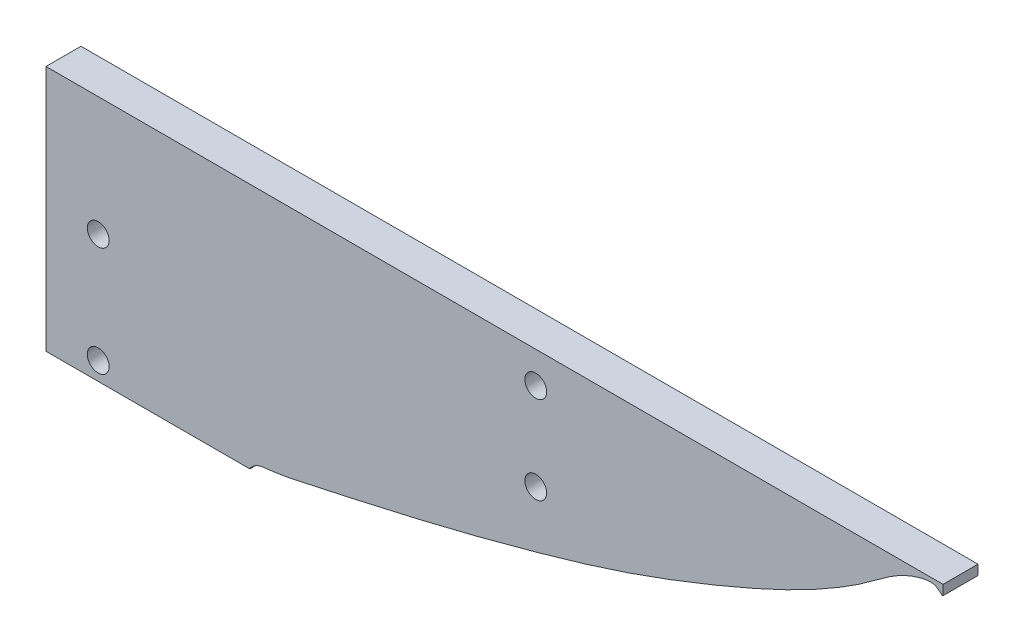
ISO-10303-21;
HEADER;
FILE_DESCRIPTION(('STEP AP214'),'2;1');
FILE_NAME('part.step','',(''),(''),'','','');
FILE_SCHEMA(('AUTOMOTIVE_DESIGN { 1 0 10303 214 1 1 1 1 }'));
ENDSEC;
DATA;
#1=APPLICATION_CONTEXT('core data for automotive mechanical design processes');
#2=APPLICATION_PROTOCOL_DEFINITION('international standard','automotive_design',2000,#1);
#3=PRODUCT_CONTEXT('',#1,'mechanical');
#4=PRODUCT('Part','Part','',(#3));
#5=PRODUCT_RELATED_PRODUCT_CATEGORY('part','',(#4));
#6=PRODUCT_DEFINITION_FORMATION('','',#4);
#7=PRODUCT_DEFINITION_CONTEXT('part definition',#1,'design');
#8=PRODUCT_DEFINITION('design','',#6,#7);
#9=PRODUCT_DEFINITION_SHAPE('','',#8);
#10=(LENGTH_UNIT() NAMED_UNIT(*) SI_UNIT(.MILLI.,.METRE.));
#11=(NAMED_UNIT(*) PLANE_ANGLE_UNIT() SI_UNIT($,.RADIAN.));
#12=(NAMED_UNIT(*) SI_UNIT($,.STERADIAN.) SOLID_ANGLE_UNIT());
#13=UNCERTAINTY_MEASURE_WITH_UNIT(LENGTH_MEASURE(1.E-05),#10,'distance_accuracy_value','');
#14=(GEOMETRIC_REPRESENTATION_CONTEXT(3) GLOBAL_UNCERTAINTY_ASSIGNED_CONTEXT((#13)) GLOBAL_UNIT_ASSIGNED_CONTEXT((#10,
#11,#12)) REPRESENTATION_CONTEXT('',''));
#15=CARTESIAN_POINT('',(0.,0.,0.));
#16=DIRECTION('',(0.,0.,1.));
#17=DIRECTION('',(1.,0.,0.));
#18=AXIS2_PLACEMENT_3D('',#15,#16,#17);
#19=CARTESIAN_POINT('',(16.4814749501142,-33.0412839476885,252.));
#20=DIRECTION('',(0.,0.,-1.));
#21=DIRECTION('',(-1.,0.,0.));
#22=AXIS2_PLACEMENT_3D('',#19,#20,#21);
#23=PLANE('',#22);
#24=CARTESIAN_POINT('',(-100.,-50.,252.));
#25=DIRECTION('',(0.,0.,-1.));
#26=DIRECTION('',(-1.,0.,0.));
#27=AXIS2_PLACEMENT_3D('',#24,#25,#26);
#28=CIRCLE('',#27,2.5);
#29=CARTESIAN_POINT('',(-102.5,-50.,252.));
#30=VERTEX_POINT('',#29);
#31=EDGE_CURVE('E242',#30,#30,#28,.F.);
#32=ORIENTED_EDGE('',*,*,#31,.F.);
#33=EDGE_LOOP('',(#32));
#34=FACE_BOUND('',#33,.T.);
#35=CARTESIAN_POINT('',(0.0705666698621599,-4.96037406111782,252.));
#36=DIRECTION('',(0.,0.,-1.));
#37=DIRECTION('',(-1.,0.,0.));
#38=AXIS2_PLACEMENT_3D('',#35,#36,#37);
#39=CIRCLE('',#38,2.5);
#40=CARTESIAN_POINT('',(-2.42943333013784,-4.96037406111782,252.));
#41=VERTEX_POINT('',#40);
#42=EDGE_CURVE('E238',#41,#41,#39,.F.);
#43=ORIENTED_EDGE('',*,*,#42,.F.);
#44=EDGE_LOOP('',(#43));
#45=FACE_BOUND('',#44,.T.);
#46=CARTESIAN_POINT('',(92.87119894696,0.,252.));
#47=CARTESIAN_POINT('',(92.8297619964041,0.106019602858424,252.));
#48=CARTESIAN_POINT('',(92.7563369042141,0.193951666438563,252.));
#49=CARTESIAN_POINT('',(92.5894412004529,0.346366788847654,252.));
#50=CARTESIAN_POINT('',(92.4993582683935,0.413961215282631,252.));
#51=CARTESIAN_POINT('',(92.2301219766467,0.6180588475246,252.));
#52=CARTESIAN_POINT('',(92.0547415126628,0.759863970032015,252.));
#53=CARTESIAN_POINT('',(91.7712058441968,0.94476606212991,252.));
#54=CARTESIAN_POINT('',(91.6747878502508,1.00219299948344,252.));
#55=CARTESIAN_POINT('',(91.4749259189541,1.10153943458853,252.));
#56=CARTESIAN_POINT('',(91.371119158257,1.14265812014957,252.));
#57=CARTESIAN_POINT('',(91.1561933791431,1.20875610778858,252.));
#58=CARTESIAN_POINT('',(91.0448646031759,1.23379722096555,252.));
#59=CARTESIAN_POINT('',(90.8232310564313,1.26956372201819,252.));
#60=CARTESIAN_POINT('',(90.7119772059547,1.2806529876919,252.));
#61=CARTESIAN_POINT('',(90.377279671004,1.29937173192576,252.));
#62=CARTESIAN_POINT('',(90.1522057438715,1.29297126720823,252.));
#63=CARTESIAN_POINT('',(89.7040522998543,1.25960002046254,252.));
#64=CARTESIAN_POINT('',(89.4821719772594,1.23363418908526,252.));
#65=CARTESIAN_POINT('',(88.8220665084708,1.13234815197405,252.));
#66=CARTESIAN_POINT('',(88.3895607097367,1.03286260830527,252.));
#67=CARTESIAN_POINT('',(87.5317890881934,0.803301236655992,252.));
#68=CARTESIAN_POINT('',(87.1066625999278,0.672636693554199,252.));
#69=CARTESIAN_POINT('',(86.2630594348859,0.383210880761718,252.));
#70=CARTESIAN_POINT('',(85.8452930328515,0.225077497987893,252.));
#71=CARTESIAN_POINT('',(84.6146426844527,-0.28090158875408,252.));
#72=CARTESIAN_POINT('',(83.8203597068015,-0.663369802015105,252.));
#73=CARTESIAN_POINT('',(81.5141474367539,-1.94308714798854,252.));
#74=CARTESIAN_POINT('',(80.0752874450909,-2.96648995901711,252.));
#75=CARTESIAN_POINT('',(77.935443731957,-4.53344154974398,252.));
#76=CARTESIAN_POINT('',(77.2245904791132,-5.05984441527253,252.));
#77=CARTESIAN_POINT('',(75.7923553151739,-6.09534324905833,252.));
#78=CARTESIAN_POINT('',(75.0722059388788,-6.6065062284586,252.));
#79=CARTESIAN_POINT('',(72.889646701115,-8.10387392019513,252.));
#80=CARTESIAN_POINT('',(71.4041535392722,-9.0523691903412,252.));
#81=CARTESIAN_POINT('',(68.3916698415289,-10.8815686087954,252.));
#82=CARTESIAN_POINT('',(66.8651359297818,-11.7630187094517,252.));
#83=CARTESIAN_POINT('',(63.7818755622298,-13.4765956347909,252.));
#84=CARTESIAN_POINT('',(62.2247762026938,-14.3081132748484,252.));
#85=CARTESIAN_POINT('',(59.0793553399535,-15.920143299968,252.));
#86=CARTESIAN_POINT('',(57.4931335873966,-16.70045815765,252.));
#87=CARTESIAN_POINT('',(54.3022363772366,-18.2196225773269,252.));
#88=CARTESIAN_POINT('',(52.6971128132982,-18.9588029595532,252.));
#89=CARTESIAN_POINT('',(49.4729256771093,-20.407768079987,252.));
#90=CARTESIAN_POINT('',(47.8541403564099,-21.1172518106264,252.));
#91=CARTESIAN_POINT('',(42.9814390535791,-23.2065112434905,252.));
#92=CARTESIAN_POINT('',(39.7104670672842,-24.5481802215175,252.));
#93=CARTESIAN_POINT('',(33.137913883606,-27.1475207195668,252.));
#94=CARTESIAN_POINT('',(29.8360593416133,-28.4057926541035,252.));
#95=CARTESIAN_POINT('',(23.1907768676553,-30.8118554742943,252.));
#96=CARTESIAN_POINT('',(19.8450900952242,-31.9570586258011,252.));
#97=CARTESIAN_POINT('',(13.117859805004,-34.1255092695759,252.));
#98=CARTESIAN_POINT('',(9.73614381439525,-35.1503574685092,252.));
#99=CARTESIAN_POINT('',(2.94941132880552,-37.1236200382927,252.));
#100=CARTESIAN_POINT('',(-0.455160547076547,-38.0744756309667,252.));
#101=CARTESIAN_POINT('',(-7.27487317680096,-39.9338633250674,252.));
#102=CARTESIAN_POINT('',(-10.6907695118805,-40.8406332271087,252.));
#103=CARTESIAN_POINT('',(-17.53700760564,-42.5993477020817,252.));
#104=CARTESIAN_POINT('',(-20.9677993150382,-43.4503875043065,252.));
#105=CARTESIAN_POINT('',(-27.8424277699808,-45.0969166338072,252.));
#106=CARTESIAN_POINT('',(-31.2862632572644,-45.8930266577726,252.));
#107=CARTESIAN_POINT('',(-38.1802433802034,-47.4572358476338,252.));
#108=CARTESIAN_POINT('',(-41.6298902693329,-48.2276032086068,252.));
#109=CARTESIAN_POINT('',(-46.8055820923552,-49.3775850217301,252.));
#110=CARTESIAN_POINT('',(-48.5311835389944,-49.7592387968446,252.));
#111=CARTESIAN_POINT('',(-51.1210783788184,-50.3248646288019,252.));
#112=CARTESIAN_POINT('',(-51.9846263366338,-50.512262674059,252.));
#113=CARTESIAN_POINT('',(-53.7121898584833,-50.8849164275284,252.));
#114=CARTESIAN_POINT('',(-54.5757760901811,-51.0726310887067,252.));
#115=CARTESIAN_POINT('',(-56.3061062744844,-51.4307242643383,252.));
#116=CARTESIAN_POINT('',(-57.1733434692533,-51.5983294363245,252.));
#117=CARTESIAN_POINT('',(-58.4815211004922,-51.8093085953905,252.));
#118=CARTESIAN_POINT('',(-58.9187686951172,-51.8731652366322,252.));
#119=CARTESIAN_POINT('',(-59.7957345606241,-51.9868595658355,252.));
#120=CARTESIAN_POINT('',(-60.2355749336929,-52.0339510240081,252.));
#121=CARTESIAN_POINT('',(-61.1157272547898,-52.124744806547,252.));
#122=CARTESIAN_POINT('',(-61.5555831871447,-52.1717244426191,252.));
#123=CARTESIAN_POINT('',(-62.2111275523685,-52.2726627445188,252.));
#124=CARTESIAN_POINT('',(-62.4289564526132,-52.311238213676,252.));
#125=CARTESIAN_POINT('',(-62.8623560524018,-52.4046184792378,252.));
#126=CARTESIAN_POINT('',(-63.0787246569691,-52.4602000213685,252.));
#127=CARTESIAN_POINT('',(-63.4982537936335,-52.5989667276517,252.));
#128=CARTESIAN_POINT('',(-63.7020822803036,-52.6822378686483,252.));
#129=CARTESIAN_POINT('',(-64.091945671796,-52.8904092089914,252.));
#130=CARTESIAN_POINT('',(-64.2774142623489,-53.0195351345395,252.));
#131=CARTESIAN_POINT('',(-64.620858265722,-53.3017291026632,252.));
#132=CARTESIAN_POINT('',(-64.7796473477165,-53.4569721980261,252.));
#133=CARTESIAN_POINT('',(-65.0149965132719,-53.6929371889678,252.));
#134=CARTESIAN_POINT('',(-65.0925030185093,-53.7731824097379,252.));
#135=CARTESIAN_POINT('',(-65.1966720616947,-53.9050264774114,252.));
#136=CARTESIAN_POINT('',(-65.2285016438491,-53.950670482461,252.));
#137=CARTESIAN_POINT('',(-65.2816362477161,-54.0481274534194,252.));
#138=CARTESIAN_POINT('',(-65.3031704805864,-54.1010374843023,252.));
#139=CARTESIAN_POINT('',(-65.3161160479043,-54.1554074522379,252.));
#140=B_SPLINE_CURVE_WITH_KNOTS('',3,(#46,#47,#48,#49,#50,#51,#52,#53,#54,#55,#56,#57,#58,#59,
#60,#61,#62,#63,#64,#65,#66,#67,#68,#69,#70,#71,#72,#73,#74,#75,#76,#77,#78,#79,#80,#81,#82,#83,
#84,#85,#86,#87,#88,#89,#90,#91,#92,#93,#94,#95,#96,#97,#98,#99,#100,#101,#102,#103,#104,#105,
#106,#107,#108,#109,#110,#111,#112,#113,#114,#115,#116,#117,#118,#119,#120,#121,#122,#123,#124,
#125,#126,#127,#128,#129,#130,#131,#132,#133,#134,#135,#136,#137,#138,#139),.UNSPECIFIED.,.F.,
.F.,(4,2,2,2,2,2,2,2,2,2,2,2,2,2,2,2,2,2,2,2,2,2,2,2,2,2,2,2,2,2,2,2,2,2,2,2,2,2,2,2,2,2,2,2,2,
2,4),(0.,0.00195312499999967,0.00390624999999944,0.007812499999999,0.00976562499999889,
0.0117187499999988,0.0136718749999988,0.0156249999999987,0.0195312499999987,0.0234374999999988,
0.0312499999999989,0.0390624999999989,0.046874999999999,0.0624999999999992,0.0937499999999997,
0.109375,0.125,0.15625,0.1875,0.21875,0.25,0.28125,0.3125,0.375,0.4375,0.5,0.5625,0.625,0.6875,
0.75,0.8125,0.875,0.90625,0.921875,0.9375,0.953125,0.9609375,0.96875,0.9765625,0.98046875,
0.984375,0.98828125,0.9921875,0.99609375,0.998046875,0.9990234375,1.),.UNSPECIFIED.);
#141=CARTESIAN_POINT('',(-65.3161160479044,-54.1554074522379,252.));
#142=VERTEX_POINT('',#141);
#143=CARTESIAN_POINT('',(92.8711989469597,0.,252.));
#144=VERTEX_POINT('',#143);
#145=EDGE_CURVE('E196',#142,#144,#140,.F.);
#146=ORIENTED_EDGE('',*,*,#145,.T.);
#147=DIRECTION('',(1.,-2.05219675574847E-13,0.));
#148=VECTOR('',#147,1.);
#149=CARTESIAN_POINT('',(92.8711989469597,0.,252.));
#150=LINE('',#149,#148);
#151=CARTESIAN_POINT('',(93.2260271485227,0.,252.));
#152=VERTEX_POINT('',#151);
#153=EDGE_CURVE('E90',#144,#152,#150,.T.);
#154=ORIENTED_EDGE('',*,*,#153,.T.);
#155=DIRECTION('',(0.,1.,0.));
#156=VECTOR('',#155,1.);
#157=CARTESIAN_POINT('',(93.2260271485227,2.25600000000004,252.));
#158=LINE('',#157,#156);
#159=CARTESIAN_POINT('',(93.2260271485227,2.25600000000004,252.));
#160=VERTEX_POINT('',#159);
#161=EDGE_CURVE('E103',#152,#160,#158,.T.);
#162=ORIENTED_EDGE('',*,*,#161,.T.);
#163=DIRECTION('',(-1.,0.,0.));
#164=VECTOR('',#163,1.);
#165=CARTESIAN_POINT('',(93.2260271485227,2.25600000000004,252.));
#166=LINE('',#165,#164);
#167=CARTESIAN_POINT('',(-111.94165154315,2.25600000000002,252.));
#168=VERTEX_POINT('',#167);
#169=EDGE_CURVE('E97',#160,#168,#166,.T.);
#170=ORIENTED_EDGE('',*,*,#169,.T.);
#171=DIRECTION('',(0.,-1.,0.));
#172=VECTOR('',#171,1.);
#173=CARTESIAN_POINT('',(-111.94165154315,-54.1672243723816,252.));
#174=LINE('',#173,#172);
#175=CARTESIAN_POINT('',(-111.94165154315,-54.1672243723816,252.));
#176=VERTEX_POINT('',#175);
#177=EDGE_CURVE('E101',#168,#176,#174,.T.);
#178=ORIENTED_EDGE('',*,*,#177,.T.);
#179=CARTESIAN_POINT('',(-65.3161160479044,-54.1554074522379,252.));
#180=CARTESIAN_POINT('',(-80.8579605109039,-54.1615180019647,252.));
#181=CARTESIAN_POINT('',(-96.3998059916295,-54.165352587656,252.));
#182=CARTESIAN_POINT('',(-111.94165154315,-54.1672243723815,252.));
#183=B_SPLINE_CURVE_WITH_KNOTS('',3,(#179,#180,#181,#182),.UNSPECIFIED.,.F.,.F.,(4,4),(0.,1.),.UNSPECIFIED.);
#184=EDGE_CURVE('E51',#176,#142,#183,.F.);
#185=ORIENTED_EDGE('',*,*,#184,.T.);
#186=EDGE_LOOP('',(#146,#154,#162,#170,#178,#185));
#187=FACE_BOUND('',#186,.T.);
#188=CARTESIAN_POINT('',(0.0705666698621599,-25.,252.));
#189=DIRECTION('',(0.,0.,-1.));
#190=DIRECTION('',(-1.,0.,0.));
#191=AXIS2_PLACEMENT_3D('',#188,#189,#190);
#192=CIRCLE('',#191,2.5);
#193=CARTESIAN_POINT('',(-2.42943333013784,-25.,252.));
#194=VERTEX_POINT('',#193);
#195=EDGE_CURVE('E239',#194,#194,#192,.F.);
#196=ORIENTED_EDGE('',*,*,#195,.F.);
#197=EDGE_LOOP('',(#196));
#198=FACE_BOUND('',#197,.T.);
#199=CARTESIAN_POINT('',(-100.,-25.,252.));
#200=DIRECTION('',(0.,0.,-1.));
#201=DIRECTION('',(-1.,0.,0.));
#202=AXIS2_PLACEMENT_3D('',#199,#200,#201);
#203=CIRCLE('',#202,2.5);
#204=CARTESIAN_POINT('',(-102.5,-25.,252.));
#205=VERTEX_POINT('',#204);
#206=EDGE_CURVE('E245',#205,#205,#203,.F.);
#207=ORIENTED_EDGE('',*,*,#206,.F.);
#208=EDGE_LOOP('',(#207));
#209=FACE_BOUND('',#208,.T.);
#210=ADVANCED_FACE('F30',(#34,#45,#187,#198,#209),#23,.F.);
#211=CARTESIAN_POINT('',(16.4814749501142,-33.0412839476885,244.));
#212=DIRECTION('',(0.,0.,-1.));
#213=DIRECTION('',(-1.,0.,0.));
#214=AXIS2_PLACEMENT_3D('',#211,#212,#213);
#215=PLANE('',#214);
#216=CARTESIAN_POINT('',(-100.,-50.,244.));
#217=DIRECTION('',(0.,0.,-1.));
#218=DIRECTION('',(-1.,0.,0.));
#219=AXIS2_PLACEMENT_3D('',#216,#217,#218);
#220=CIRCLE('',#219,2.5);
#221=CARTESIAN_POINT('',(-102.5,-50.,244.));
#222=VERTEX_POINT('',#221);
#223=EDGE_CURVE('E243',#222,#222,#220,.F.);
#224=ORIENTED_EDGE('',*,*,#223,.T.);
#225=EDGE_LOOP('',(#224));
#226=FACE_BOUND('',#225,.T.);
#227=CARTESIAN_POINT('',(0.0705666698621599,-4.96037406111782,244.));
#228=DIRECTION('',(0.,0.,-1.));
#229=DIRECTION('',(-1.,0.,0.));
#230=AXIS2_PLACEMENT_3D('',#227,#228,#229);
#231=CIRCLE('',#230,2.5);
#232=CARTESIAN_POINT('',(-2.42943333013784,-4.96037406111782,244.));
#233=VERTEX_POINT('',#232);
#234=EDGE_CURVE('E235',#233,#233,#231,.F.);
#235=ORIENTED_EDGE('',*,*,#234,.T.);
#236=EDGE_LOOP('',(#235));
#237=FACE_BOUND('',#236,.T.);
#238=CARTESIAN_POINT('',(-65.3161160479043,-54.1554074522379,244.));
#239=CARTESIAN_POINT('',(-65.3031704805864,-54.1010374843023,244.));
#240=CARTESIAN_POINT('',(-65.2816362477161,-54.0481274534194,244.));
#241=CARTESIAN_POINT('',(-65.2285016438491,-53.950670482461,244.));
#242=CARTESIAN_POINT('',(-65.1966720616947,-53.9050264774114,244.));
#243=CARTESIAN_POINT('',(-65.0925030185093,-53.7731824097379,244.));
#244=CARTESIAN_POINT('',(-65.0149965132719,-53.6929371889678,244.));
#245=CARTESIAN_POINT('',(-64.7796473477165,-53.4569721980261,244.));
#246=CARTESIAN_POINT('',(-64.620858265722,-53.3017291026632,244.));
#247=CARTESIAN_POINT('',(-64.2774142623489,-53.0195351345395,244.));
#248=CARTESIAN_POINT('',(-64.091945671796,-52.8904092089914,244.));
#249=CARTESIAN_POINT('',(-63.7020822803036,-52.6822378686483,244.));
#250=CARTESIAN_POINT('',(-63.4982537936335,-52.5989667276517,244.));
#251=CARTESIAN_POINT('',(-63.0787246569691,-52.4602000213685,244.));
#252=CARTESIAN_POINT('',(-62.8623560524018,-52.4046184792378,244.));
#253=CARTESIAN_POINT('',(-62.4289564526132,-52.311238213676,244.));
#254=CARTESIAN_POINT('',(-62.2111275523685,-52.2726627445188,244.));
#255=CARTESIAN_POINT('',(-61.5555831871447,-52.1717244426191,244.));
#256=CARTESIAN_POINT('',(-61.1157272547898,-52.124744806547,244.));
#257=CARTESIAN_POINT('',(-60.2355749336929,-52.0339510240081,244.));
#258=CARTESIAN_POINT('',(-59.7957345606241,-51.9868595658355,244.));
#259=CARTESIAN_POINT('',(-58.9187686951172,-51.8731652366322,244.));
#260=CARTESIAN_POINT('',(-58.4815211004922,-51.8093085953905,244.));
#261=CARTESIAN_POINT('',(-57.1733434692533,-51.5983294363245,244.));
#262=CARTESIAN_POINT('',(-56.3061062744844,-51.4307242643383,244.));
#263=CARTESIAN_POINT('',(-54.5757760901811,-51.0726310887067,244.));
#264=CARTESIAN_POINT('',(-53.7121898584833,-50.8849164275284,244.));
#265=CARTESIAN_POINT('',(-51.9846263366338,-50.512262674059,244.));
#266=CARTESIAN_POINT('',(-51.1210783788184,-50.3248646288019,244.));
#267=CARTESIAN_POINT('',(-48.5311835389944,-49.7592387968446,244.));
#268=CARTESIAN_POINT('',(-46.8055820923552,-49.3775850217301,244.));
#269=CARTESIAN_POINT('',(-41.6298902693329,-48.2276032086068,244.));
#270=CARTESIAN_POINT('',(-38.1802433802034,-47.4572358476338,244.));
#271=CARTESIAN_POINT('',(-31.2862632572644,-45.8930266577726,244.));
#272=CARTESIAN_POINT('',(-27.8424277699808,-45.0969166338072,244.));
#273=CARTESIAN_POINT('',(-20.9677993150382,-43.4503875043065,244.));
#274=CARTESIAN_POINT('',(-17.53700760564,-42.5993477020817,244.));
#275=CARTESIAN_POINT('',(-10.6907695118805,-40.8406332271087,244.));
#276=CARTESIAN_POINT('',(-7.27487317680096,-39.9338633250674,244.));
#277=CARTESIAN_POINT('',(-0.455160547076547,-38.0744756309667,244.));
#278=CARTESIAN_POINT('',(2.94941132880552,-37.1236200382927,244.));
#279=CARTESIAN_POINT('',(9.73614381439525,-35.1503574685092,244.));
#280=CARTESIAN_POINT('',(13.117859805004,-34.1255092695759,244.));
#281=CARTESIAN_POINT('',(19.8450900952242,-31.9570586258011,244.));
#282=CARTESIAN_POINT('',(23.1907768676553,-30.8118554742943,244.));
#283=CARTESIAN_POINT('',(29.8360593416133,-28.4057926541035,244.));
#284=CARTESIAN_POINT('',(33.137913883606,-27.1475207195668,244.));
#285=CARTESIAN_POINT('',(39.7104670672842,-24.5481802215175,244.));
#286=CARTESIAN_POINT('',(42.9814390535791,-23.2065112434905,244.));
#287=CARTESIAN_POINT('',(47.8541403564099,-21.1172518106264,244.));
#288=CARTESIAN_POINT('',(49.4729256771093,-20.407768079987,244.));
#289=CARTESIAN_POINT('',(52.6971128132982,-18.9588029595532,244.));
#290=CARTESIAN_POINT('',(54.3022363772366,-18.2196225773269,244.));
#291=CARTESIAN_POINT('',(57.4931335873966,-16.70045815765,244.));
#292=CARTESIAN_POINT('',(59.0793553399535,-15.920143299968,244.));
#293=CARTESIAN_POINT('',(62.2247762026938,-14.3081132748484,244.));
#294=CARTESIAN_POINT('',(63.7818755622298,-13.4765956347909,244.));
#295=CARTESIAN_POINT('',(66.8651359297818,-11.7630187094517,244.));
#296=CARTESIAN_POINT('',(68.3916698415289,-10.8815686087954,244.));
#297=CARTESIAN_POINT('',(71.4041535392722,-9.0523691903412,244.));
#298=CARTESIAN_POINT('',(72.889646701115,-8.10387392019513,244.));
#299=CARTESIAN_POINT('',(75.0722059388788,-6.6065062284586,244.));
#300=CARTESIAN_POINT('',(75.7923553151739,-6.09534324905833,244.));
#301=CARTESIAN_POINT('',(77.2245904791132,-5.05984441527253,244.));
#302=CARTESIAN_POINT('',(77.935443731957,-4.53344154974398,244.));
#303=CARTESIAN_POINT('',(80.0752874450909,-2.96648995901711,244.));
#304=CARTESIAN_POINT('',(81.5141474367539,-1.94308714798854,244.));
#305=CARTESIAN_POINT('',(83.8203597068015,-0.663369802015105,244.));
#306=CARTESIAN_POINT('',(84.6146426844527,-0.28090158875408,244.));
#307=CARTESIAN_POINT('',(85.8452930328515,0.225077497987893,244.));
#308=CARTESIAN_POINT('',(86.2630594348859,0.383210880761718,244.));
#309=CARTESIAN_POINT('',(87.1066625999278,0.672636693554199,244.));
#310=CARTESIAN_POINT('',(87.5317890881934,0.803301236655992,244.));
#311=CARTESIAN_POINT('',(88.3895607097367,1.03286260830527,244.));
#312=CARTESIAN_POINT('',(88.8220665084708,1.13234815197405,244.));
#313=CARTESIAN_POINT('',(89.4821719772594,1.23363418908526,244.));
#314=CARTESIAN_POINT('',(89.7040522998543,1.25960002046254,244.));
#315=CARTESIAN_POINT('',(90.1522057438715,1.29297126720823,244.));
#316=CARTESIAN_POINT('',(90.377279671004,1.29937173192576,244.));
#317=CARTESIAN_POINT('',(90.7119772059547,1.2806529876919,244.));
#318=CARTESIAN_POINT('',(90.8232310564313,1.26956372201819,244.));
#319=CARTESIAN_POINT('',(91.0448646031759,1.23379722096555,244.));
#320=CARTESIAN_POINT('',(91.1561933791431,1.20875610778858,244.));
#321=CARTESIAN_POINT('',(91.371119158257,1.14265812014957,244.));
#322=CARTESIAN_POINT('',(91.4749259189541,1.10153943458853,244.));
#323=CARTESIAN_POINT('',(91.6747878502508,1.00219299948344,244.));
#324=CARTESIAN_POINT('',(91.7712058441968,0.94476606212991,244.));
#325=CARTESIAN_POINT('',(92.0547415126628,0.759863970032015,244.));
#326=CARTESIAN_POINT('',(92.2301219766467,0.6180588475246,244.));
#327=CARTESIAN_POINT('',(92.4993582683935,0.413961215282631,244.));
#328=CARTESIAN_POINT('',(92.5894412004529,0.346366788847654,244.));
#329=CARTESIAN_POINT('',(92.7563369042141,0.193951666438563,244.));
#330=CARTESIAN_POINT('',(92.8297619964041,0.106019602858424,244.));
#331=CARTESIAN_POINT('',(92.87119894696,0.,244.));
#332=B_SPLINE_CURVE_WITH_KNOTS('',3,(#238,#239,#240,#241,#242,#243,#244,#245,#246,#247,#248,
#249,#250,#251,#252,#253,#254,#255,#256,#257,#258,#259,#260,#261,#262,#263,#264,#265,#266,#267,
#268,#269,#270,#271,#272,#273,#274,#275,#276,#277,#278,#279,#280,#281,#282,#283,#284,#285,#286,
#287,#288,#289,#290,#291,#292,#293,#294,#295,#296,#297,#298,#299,#300,#301,#302,#303,#304,#305,
#306,#307,#308,#309,#310,#311,#312,#313,#314,#315,#316,#317,#318,#319,#320,#321,#322,#323,#324,
#325,#326,#327,#328,#329,#330,#331),.UNSPECIFIED.,.F.,.F.,(4,2,2,2,2,2,2,2,2,2,2,2,2,2,2,2,2,2,
2,2,2,2,2,2,2,2,2,2,2,2,2,2,2,2,2,2,2,2,2,2,2,2,2,2,2,2,4),(0.,0.0009765625,0.001953125,
0.00390625000000011,0.0078125,0.01171875,0.015625,0.01953125,0.0234374999999999,
0.0312499999999999,0.0390624999999998,0.0468749999999998,0.0624999999999998,0.0781249999999998,
0.0937499999999998,0.125,0.1875,0.25,0.3125,0.375,0.4375,0.5,0.5625,0.625,0.6875,0.71875,0.75,
0.78125,0.8125,0.84375,0.875,0.890625,0.90625,0.937500000000001,0.953125000000001,
0.960937500000001,0.968750000000001,0.976562500000001,0.980468750000001,0.984375000000001,
0.986328125000001,0.988281250000001,0.990234375000001,0.992187500000001,0.996093750000001,
0.998046875,1.),.UNSPECIFIED.);
#333=CARTESIAN_POINT('',(-65.3161160479044,-54.1554074522379,244.));
#334=VERTEX_POINT('',#333);
#335=CARTESIAN_POINT('',(92.8711989469597,0.,244.));
#336=VERTEX_POINT('',#335);
#337=EDGE_CURVE('E213',#334,#336,#332,.T.);
#338=ORIENTED_EDGE('',*,*,#337,.F.);
#339=CARTESIAN_POINT('',(-111.94165154315,-54.1672243723815,244.));
#340=CARTESIAN_POINT('',(-96.3998059916295,-54.165352587656,244.));
#341=CARTESIAN_POINT('',(-80.8579605109039,-54.1615180019647,244.));
#342=CARTESIAN_POINT('',(-65.3161160479044,-54.1554074522379,244.));
#343=B_SPLINE_CURVE_WITH_KNOTS('',3,(#339,#340,#341,#342),.UNSPECIFIED.,.F.,.F.,(4,4),(0.,1.),.UNSPECIFIED.);
#344=CARTESIAN_POINT('',(-111.94165154315,-54.1672243723816,244.));
#345=VERTEX_POINT('',#344);
#346=EDGE_CURVE('E81',#345,#334,#343,.T.);
#347=ORIENTED_EDGE('',*,*,#346,.F.);
#348=DIRECTION('',(0.,-1.,0.));
#349=VECTOR('',#348,1.);
#350=CARTESIAN_POINT('',(-111.94165154315,-54.1672243723816,244.));
#351=LINE('',#350,#349);
#352=CARTESIAN_POINT('',(-111.94165154315,2.25600000000002,244.));
#353=VERTEX_POINT('',#352);
#354=EDGE_CURVE('E75',#353,#345,#351,.T.);
#355=ORIENTED_EDGE('',*,*,#354,.F.);
#356=DIRECTION('',(-1.,0.,0.));
#357=VECTOR('',#356,1.);
#358=CARTESIAN_POINT('',(93.2260271485227,2.25600000000004,244.));
#359=LINE('',#358,#357);
#360=CARTESIAN_POINT('',(93.2260271485227,2.25600000000004,244.));
#361=VERTEX_POINT('',#360);
#362=EDGE_CURVE('E111',#361,#353,#359,.T.);
#363=ORIENTED_EDGE('',*,*,#362,.F.);
#364=DIRECTION('',(0.,1.,0.));
#365=VECTOR('',#364,1.);
#366=CARTESIAN_POINT('',(93.2260271485227,2.25600000000004,244.));
#367=LINE('',#366,#365);
#368=CARTESIAN_POINT('',(93.2260271485227,0.,244.));
#369=VERTEX_POINT('',#368);
#370=EDGE_CURVE('E158',#369,#361,#367,.T.);
#371=ORIENTED_EDGE('',*,*,#370,.F.);
#372=DIRECTION('',(1.,-2.05219675574847E-13,0.));
#373=VECTOR('',#372,1.);
#374=CARTESIAN_POINT('',(92.8711989469597,0.,244.));
#375=LINE('',#374,#373);
#376=EDGE_CURVE('E163',#336,#369,#375,.T.);
#377=ORIENTED_EDGE('',*,*,#376,.F.);
#378=EDGE_LOOP('',(#338,#347,#355,#363,#371,#377));
#379=FACE_BOUND('',#378,.T.);
#380=CARTESIAN_POINT('',(0.0705666698621599,-25.,244.));
#381=DIRECTION('',(0.,0.,-1.));
#382=DIRECTION('',(-1.,0.,0.));
#383=AXIS2_PLACEMENT_3D('',#380,#381,#382);
#384=CIRCLE('',#383,2.5);
#385=CARTESIAN_POINT('',(-2.42943333013784,-25.,244.));
#386=VERTEX_POINT('',#385);
#387=EDGE_CURVE('E240',#386,#386,#384,.F.);
#388=ORIENTED_EDGE('',*,*,#387,.T.);
#389=EDGE_LOOP('',(#388));
#390=FACE_BOUND('',#389,.T.);
#391=CARTESIAN_POINT('',(-100.,-25.,244.));
#392=DIRECTION('',(0.,0.,-1.));
#393=DIRECTION('',(-1.,0.,0.));
#394=AXIS2_PLACEMENT_3D('',#391,#392,#393);
#395=CIRCLE('',#394,2.5);
#396=CARTESIAN_POINT('',(-102.5,-25.,244.));
#397=VERTEX_POINT('',#396);
#398=EDGE_CURVE('E36',#397,#397,#395,.F.);
#399=ORIENTED_EDGE('',*,*,#398,.T.);
#400=EDGE_LOOP('',(#399));
#401=FACE_BOUND('',#400,.T.);
#402=ADVANCED_FACE('F148',(#226,#237,#379,#390,#401),#215,.T.);
#403=CARTESIAN_POINT('',(-65.3161160479043,-54.1554074522379,252.));
#404=CARTESIAN_POINT('',(-65.3031704805864,-54.1010374843023,252.));
#405=CARTESIAN_POINT('',(-65.2816362477161,-54.0481274534194,252.));
#406=CARTESIAN_POINT('',(-65.2285016438491,-53.950670482461,252.));
#407=CARTESIAN_POINT('',(-65.1966720616947,-53.9050264774114,252.));
#408=CARTESIAN_POINT('',(-65.0925030185093,-53.7731824097379,252.));
#409=CARTESIAN_POINT('',(-65.0149965132719,-53.6929371889678,252.));
#410=CARTESIAN_POINT('',(-64.7796473477165,-53.4569721980261,252.));
#411=CARTESIAN_POINT('',(-64.620858265722,-53.3017291026632,252.));
#412=CARTESIAN_POINT('',(-64.2774142623489,-53.0195351345395,252.));
#413=CARTESIAN_POINT('',(-64.091945671796,-52.8904092089914,252.));
#414=CARTESIAN_POINT('',(-63.7020822803036,-52.6822378686483,252.));
#415=CARTESIAN_POINT('',(-63.4982537936335,-52.5989667276517,252.));
#416=CARTESIAN_POINT('',(-63.0787246569691,-52.4602000213685,252.));
#417=CARTESIAN_POINT('',(-62.8623560524018,-52.4046184792378,252.));
#418=CARTESIAN_POINT('',(-62.4289564526132,-52.311238213676,252.));
#419=CARTESIAN_POINT('',(-62.2111275523685,-52.2726627445188,252.));
#420=CARTESIAN_POINT('',(-61.5555831871447,-52.1717244426191,252.));
#421=CARTESIAN_POINT('',(-61.1157272547898,-52.124744806547,252.));
#422=CARTESIAN_POINT('',(-60.2355749336929,-52.0339510240081,252.));
#423=CARTESIAN_POINT('',(-59.7957345606241,-51.9868595658355,252.));
#424=CARTESIAN_POINT('',(-58.9187686951172,-51.8731652366322,252.));
#425=CARTESIAN_POINT('',(-58.4815211004922,-51.8093085953905,252.));
#426=CARTESIAN_POINT('',(-57.1733434692533,-51.5983294363245,252.));
#427=CARTESIAN_POINT('',(-56.3061062744844,-51.4307242643383,252.));
#428=CARTESIAN_POINT('',(-54.5757760901811,-51.0726310887067,252.));
#429=CARTESIAN_POINT('',(-53.7121898584833,-50.8849164275284,252.));
#430=CARTESIAN_POINT('',(-51.9846263366338,-50.512262674059,252.));
#431=CARTESIAN_POINT('',(-51.1210783788184,-50.3248646288019,252.));
#432=CARTESIAN_POINT('',(-48.5311835389944,-49.7592387968446,252.));
#433=CARTESIAN_POINT('',(-46.8055820923552,-49.3775850217301,252.));
#434=CARTESIAN_POINT('',(-41.6298902693329,-48.2276032086068,252.));
#435=CARTESIAN_POINT('',(-38.1802433802034,-47.4572358476338,252.));
#436=CARTESIAN_POINT('',(-31.2862632572644,-45.8930266577726,252.));
#437=CARTESIAN_POINT('',(-27.8424277699808,-45.0969166338072,252.));
#438=CARTESIAN_POINT('',(-20.9677993150382,-43.4503875043065,252.));
#439=CARTESIAN_POINT('',(-17.53700760564,-42.5993477020817,252.));
#440=CARTESIAN_POINT('',(-10.6907695118805,-40.8406332271087,252.));
#441=CARTESIAN_POINT('',(-7.27487317680096,-39.9338633250674,252.));
#442=CARTESIAN_POINT('',(-0.455160547076547,-38.0744756309667,252.));
#443=CARTESIAN_POINT('',(2.94941132880552,-37.1236200382927,252.));
#444=CARTESIAN_POINT('',(9.73614381439525,-35.1503574685092,252.));
#445=CARTESIAN_POINT('',(13.117859805004,-34.1255092695759,252.));
#446=CARTESIAN_POINT('',(19.8450900952242,-31.9570586258011,252.));
#447=CARTESIAN_POINT('',(23.1907768676553,-30.8118554742943,252.));
#448=CARTESIAN_POINT('',(29.8360593416133,-28.4057926541035,252.));
#449=CARTESIAN_POINT('',(33.137913883606,-27.1475207195668,252.));
#450=CARTESIAN_POINT('',(39.7104670672842,-24.5481802215175,252.));
#451=CARTESIAN_POINT('',(42.9814390535791,-23.2065112434905,252.));
#452=CARTESIAN_POINT('',(47.8541403564099,-21.1172518106264,252.));
#453=CARTESIAN_POINT('',(49.4729256771093,-20.407768079987,252.));
#454=CARTESIAN_POINT('',(52.6971128132982,-18.9588029595532,252.));
#455=CARTESIAN_POINT('',(54.3022363772366,-18.2196225773269,252.));
#456=CARTESIAN_POINT('',(57.4931335873966,-16.70045815765,252.));
#457=CARTESIAN_POINT('',(59.0793553399535,-15.920143299968,252.));
#458=CARTESIAN_POINT('',(62.2247762026938,-14.3081132748484,252.));
#459=CARTESIAN_POINT('',(63.7818755622298,-13.4765956347909,252.));
#460=CARTESIAN_POINT('',(66.8651359297818,-11.7630187094517,252.));
#461=CARTESIAN_POINT('',(68.3916698415289,-10.8815686087954,252.));
#462=CARTESIAN_POINT('',(71.4041535392722,-9.0523691903412,252.));
#463=CARTESIAN_POINT('',(72.889646701115,-8.10387392019513,252.));
#464=CARTESIAN_POINT('',(75.0722059388788,-6.6065062284586,252.));
#465=CARTESIAN_POINT('',(75.7923553151739,-6.09534324905833,252.));
#466=CARTESIAN_POINT('',(77.2245904791132,-5.05984441527253,252.));
#467=CARTESIAN_POINT('',(77.935443731957,-4.53344154974398,252.));
#468=CARTESIAN_POINT('',(80.0752874450909,-2.96648995901711,252.));
#469=CARTESIAN_POINT('',(81.5141474367539,-1.94308714798854,252.));
#470=CARTESIAN_POINT('',(83.8203597068015,-0.663369802015105,252.));
#471=CARTESIAN_POINT('',(84.6146426844527,-0.28090158875408,252.));
#472=CARTESIAN_POINT('',(85.8452930328515,0.225077497987893,252.));
#473=CARTESIAN_POINT('',(86.2630594348859,0.383210880761718,252.));
#474=CARTESIAN_POINT('',(87.1066625999278,0.672636693554199,252.));
#475=CARTESIAN_POINT('',(87.5317890881934,0.803301236655992,252.));
#476=CARTESIAN_POINT('',(88.3895607097367,1.03286260830527,252.));
#477=CARTESIAN_POINT('',(88.8220665084708,1.13234815197405,252.));
#478=CARTESIAN_POINT('',(89.4821719772594,1.23363418908526,252.));
#479=CARTESIAN_POINT('',(89.7040522998543,1.25960002046254,252.));
#480=CARTESIAN_POINT('',(90.1522057438715,1.29297126720823,252.));
#481=CARTESIAN_POINT('',(90.377279671004,1.29937173192576,252.));
#482=CARTESIAN_POINT('',(90.7119772059547,1.2806529876919,252.));
#483=CARTESIAN_POINT('',(90.8232310564313,1.26956372201819,252.));
#484=CARTESIAN_POINT('',(91.0448646031759,1.23379722096555,252.));
#485=CARTESIAN_POINT('',(91.1561933791431,1.20875610778858,252.));
#486=CARTESIAN_POINT('',(91.371119158257,1.14265812014957,252.));
#487=CARTESIAN_POINT('',(91.4749259189541,1.10153943458853,252.));
#488=CARTESIAN_POINT('',(91.6747878502508,1.00219299948344,252.));
#489=CARTESIAN_POINT('',(91.7712058441968,0.94476606212991,252.));
#490=CARTESIAN_POINT('',(92.0547415126628,0.759863970032015,252.));
#491=CARTESIAN_POINT('',(92.2301219766467,0.6180588475246,252.));
#492=CARTESIAN_POINT('',(92.4993582683935,0.413961215282631,252.));
#493=CARTESIAN_POINT('',(92.5894412004529,0.346366788847654,252.));
#494=CARTESIAN_POINT('',(92.7563369042141,0.193951666438563,252.));
#495=CARTESIAN_POINT('',(92.8297619964041,0.106019602858424,252.));
#496=CARTESIAN_POINT('',(92.87119894696,0.,252.));
#497=B_SPLINE_CURVE_WITH_KNOTS('',3,(#403,#404,#405,#406,#407,#408,#409,#410,#411,#412,#413,
#414,#415,#416,#417,#418,#419,#420,#421,#422,#423,#424,#425,#426,#427,#428,#429,#430,#431,#432,
#433,#434,#435,#436,#437,#438,#439,#440,#441,#442,#443,#444,#445,#446,#447,#448,#449,#450,#451,
#452,#453,#454,#455,#456,#457,#458,#459,#460,#461,#462,#463,#464,#465,#466,#467,#468,#469,#470,
#471,#472,#473,#474,#475,#476,#477,#478,#479,#480,#481,#482,#483,#484,#485,#486,#487,#488,#489,
#490,#491,#492,#493,#494,#495,#496),.UNSPECIFIED.,.F.,.F.,(4,2,2,2,2,2,2,2,2,2,2,2,2,2,2,2,2,2,
2,2,2,2,2,2,2,2,2,2,2,2,2,2,2,2,2,2,2,2,2,2,2,2,2,2,2,2,4),(0.,0.0009765625,0.001953125,
0.00390625000000011,0.0078125,0.01171875,0.015625,0.01953125,0.0234374999999999,
0.0312499999999999,0.0390624999999998,0.0468749999999998,0.0624999999999998,0.0781249999999998,
0.0937499999999998,0.125,0.1875,0.25,0.3125,0.375,0.4375,0.5,0.5625,0.625,0.6875,0.71875,0.75,
0.78125,0.8125,0.84375,0.875,0.890625,0.90625,0.937500000000001,0.953125000000001,
0.960937500000001,0.968750000000001,0.976562500000001,0.980468750000001,0.984375000000001,
0.986328125000001,0.988281250000001,0.990234375000001,0.992187500000001,0.996093750000001,
0.998046875,1.),.UNSPECIFIED.);
#498=DIRECTION('',(0.,0.,-1.));
#499=VECTOR('',#498,1.);
#500=SURFACE_OF_LINEAR_EXTRUSION('',#497,#499);
#501=ORIENTED_EDGE('',*,*,#337,.T.);
#502=DIRECTION('',(0.,0.,-1.));
#503=VECTOR('',#502,1.);
#504=CARTESIAN_POINT('',(92.8711989469597,0.,252.));
#505=LINE('',#504,#503);
#506=EDGE_CURVE('E11',#144,#336,#505,.T.);
#507=ORIENTED_EDGE('',*,*,#506,.F.);
#508=ORIENTED_EDGE('',*,*,#145,.F.);
#509=DIRECTION('',(0.,0.,-1.));
#510=VECTOR('',#509,1.);
#511=CARTESIAN_POINT('',(-65.3161160479044,-54.1554074522379,252.));
#512=LINE('',#511,#510);
#513=EDGE_CURVE('E117',#142,#334,#512,.T.);
#514=ORIENTED_EDGE('',*,*,#513,.T.);
#515=EDGE_LOOP('',(#501,#507,#508,#514));
#516=FACE_BOUND('',#515,.T.);
#517=ADVANCED_FACE('F32',(#516),#500,.F.);
#518=CARTESIAN_POINT('',(92.8711989469597,0.,252.));
#519=DIRECTION('',(2.05219675574847E-13,1.,0.));
#520=DIRECTION('',(-1.,2.05219675574847E-13,0.));
#521=AXIS2_PLACEMENT_3D('',#518,#519,#520);
#522=PLANE('',#521);
#523=ORIENTED_EDGE('',*,*,#376,.T.);
#524=DIRECTION('',(0.,0.,-1.));
#525=VECTOR('',#524,1.);
#526=CARTESIAN_POINT('',(93.2260271485227,0.,252.));
#527=LINE('',#526,#525);
#528=EDGE_CURVE('E42',#152,#369,#527,.T.);
#529=ORIENTED_EDGE('',*,*,#528,.F.);
#530=ORIENTED_EDGE('',*,*,#153,.F.);
#531=ORIENTED_EDGE('',*,*,#506,.T.);
#532=EDGE_LOOP('',(#523,#529,#530,#531));
#533=FACE_BOUND('',#532,.T.);
#534=ADVANCED_FACE('F338',(#533),#522,.F.);
#535=CARTESIAN_POINT('',(93.2260271485227,2.25600000000004,252.));
#536=DIRECTION('',(-1.,0.,0.));
#537=DIRECTION('',(0.,0.,1.));
#538=AXIS2_PLACEMENT_3D('',#535,#536,#537);
#539=PLANE('',#538);
#540=ORIENTED_EDGE('',*,*,#370,.T.);
#541=DIRECTION('',(0.,0.,-1.));
#542=VECTOR('',#541,1.);
#543=CARTESIAN_POINT('',(93.2260271485227,2.25600000000004,252.));
#544=LINE('',#543,#542);
#545=EDGE_CURVE('E112',#160,#361,#544,.T.);
#546=ORIENTED_EDGE('',*,*,#545,.F.);
#547=ORIENTED_EDGE('',*,*,#161,.F.);
#548=ORIENTED_EDGE('',*,*,#528,.T.);
#549=EDGE_LOOP('',(#540,#546,#547,#548));
#550=FACE_BOUND('',#549,.T.);
#551=ADVANCED_FACE('F330',(#550),#539,.F.);
#552=CARTESIAN_POINT('',(93.2260271485227,2.25600000000004,252.));
#553=DIRECTION('',(0.,-1.,0.));
#554=DIRECTION('',(1.,0.,0.));
#555=AXIS2_PLACEMENT_3D('',#552,#553,#554);
#556=PLANE('',#555);
#557=ORIENTED_EDGE('',*,*,#362,.T.);
#558=DIRECTION('',(0.,0.,-1.));
#559=VECTOR('',#558,1.);
#560=CARTESIAN_POINT('',(-111.94165154315,2.25600000000002,252.));
#561=LINE('',#560,#559);
#562=EDGE_CURVE('E108',#168,#353,#561,.T.);
#563=ORIENTED_EDGE('',*,*,#562,.F.);
#564=ORIENTED_EDGE('',*,*,#169,.F.);
#565=ORIENTED_EDGE('',*,*,#545,.T.);
#566=EDGE_LOOP('',(#557,#563,#564,#565));
#567=FACE_BOUND('',#566,.T.);
#568=ADVANCED_FACE('F109',(#567),#556,.F.);
#569=CARTESIAN_POINT('',(-111.94165154315,-54.1672243723816,252.));
#570=DIRECTION('',(1.,0.,0.));
#571=DIRECTION('',(0.,1.,0.));
#572=AXIS2_PLACEMENT_3D('',#569,#570,#571);
#573=PLANE('',#572);
#574=ORIENTED_EDGE('',*,*,#354,.T.);
#575=DIRECTION('',(0.,0.,-1.));
#576=VECTOR('',#575,1.);
#577=CARTESIAN_POINT('',(-111.94165154315,-54.1672243723816,252.));
#578=LINE('',#577,#576);
#579=EDGE_CURVE('E113',#176,#345,#578,.T.);
#580=ORIENTED_EDGE('',*,*,#579,.F.);
#581=ORIENTED_EDGE('',*,*,#177,.F.);
#582=ORIENTED_EDGE('',*,*,#562,.T.);
#583=EDGE_LOOP('',(#574,#580,#581,#582));
#584=FACE_BOUND('',#583,.T.);
#585=ADVANCED_FACE('F115',(#584),#573,.F.);
#586=CARTESIAN_POINT('',(-111.94165154315,-54.1672243723815,252.));
#587=CARTESIAN_POINT('',(-96.3998059916295,-54.165352587656,252.));
#588=CARTESIAN_POINT('',(-80.8579605109039,-54.1615180019647,252.));
#589=CARTESIAN_POINT('',(-65.3161160479044,-54.1554074522379,252.));
#590=B_SPLINE_CURVE_WITH_KNOTS('',3,(#586,#587,#588,#589),.UNSPECIFIED.,.F.,.F.,(4,4),(0.,1.),.UNSPECIFIED.);
#591=DIRECTION('',(0.,0.,-1.));
#592=VECTOR('',#591,1.);
#593=SURFACE_OF_LINEAR_EXTRUSION('',#590,#592);
#594=ORIENTED_EDGE('',*,*,#346,.T.);
#595=ORIENTED_EDGE('',*,*,#513,.F.);
#596=ORIENTED_EDGE('',*,*,#184,.F.);
#597=ORIENTED_EDGE('',*,*,#579,.T.);
#598=EDGE_LOOP('',(#594,#595,#596,#597));
#599=FACE_BOUND('',#598,.T.);
#600=ADVANCED_FACE('F136',(#599),#593,.F.);
#601=CARTESIAN_POINT('',(0.0705666698621599,-4.96037406111782,308.));
#602=DIRECTION('',(0.,0.,-1.));
#603=DIRECTION('',(-1.,0.,0.));
#604=AXIS2_PLACEMENT_3D('',#601,#602,#603);
#605=CYLINDRICAL_SURFACE('',#604,2.5);
#606=ORIENTED_EDGE('',*,*,#234,.F.);
#607=EDGE_LOOP('',(#606));
#608=FACE_BOUND('',#607,.T.);
#609=ORIENTED_EDGE('',*,*,#42,.T.);
#610=EDGE_LOOP('',(#609));
#611=FACE_BOUND('',#610,.T.);
#612=ADVANCED_FACE('F147',(#608,#611),#605,.F.);
#613=CARTESIAN_POINT('',(0.0705666698621599,-25.,308.));
#614=DIRECTION('',(0.,0.,-1.));
#615=DIRECTION('',(-1.,0.,0.));
#616=AXIS2_PLACEMENT_3D('',#613,#614,#615);
#617=CYLINDRICAL_SURFACE('',#616,2.5);
#618=ORIENTED_EDGE('',*,*,#387,.F.);
#619=EDGE_LOOP('',(#618));
#620=FACE_BOUND('',#619,.T.);
#621=ORIENTED_EDGE('',*,*,#195,.T.);
#622=EDGE_LOOP('',(#621));
#623=FACE_BOUND('',#622,.T.);
#624=ADVANCED_FACE('F269',(#620,#623),#617,.F.);
#625=CARTESIAN_POINT('',(-100.,-50.,308.));
#626=DIRECTION('',(0.,0.,-1.));
#627=DIRECTION('',(-1.,0.,0.));
#628=AXIS2_PLACEMENT_3D('',#625,#626,#627);
#629=CYLINDRICAL_SURFACE('',#628,2.5);
#630=ORIENTED_EDGE('',*,*,#223,.F.);
#631=EDGE_LOOP('',(#630));
#632=FACE_BOUND('',#631,.T.);
#633=ORIENTED_EDGE('',*,*,#31,.T.);
#634=EDGE_LOOP('',(#633));
#635=FACE_BOUND('',#634,.T.);
#636=ADVANCED_FACE('F274',(#632,#635),#629,.F.);
#637=CARTESIAN_POINT('',(-100.,-25.,308.));
#638=DIRECTION('',(0.,0.,-1.));
#639=DIRECTION('',(-1.,0.,0.));
#640=AXIS2_PLACEMENT_3D('',#637,#638,#639);
#641=CYLINDRICAL_SURFACE('',#640,2.5);
#642=ORIENTED_EDGE('',*,*,#398,.F.);
#643=EDGE_LOOP('',(#642));
#644=FACE_BOUND('',#643,.T.);
#645=ORIENTED_EDGE('',*,*,#206,.T.);
#646=EDGE_LOOP('',(#645));
#647=FACE_BOUND('',#646,.T.);
#648=ADVANCED_FACE('F284',(#644,#647),#641,.F.);
#649=CLOSED_SHELL('',(#210,#402,#517,#534,#551,#568,#585,#600,#612,#624,#636,#648));
#650=MANIFOLD_SOLID_BREP('B2',#649);
#651=ADVANCED_BREP_SHAPE_REPRESENTATION('',(#18,#650),#14);
#652=SHAPE_DEFINITION_REPRESENTATION(#9,#651);
ENDSEC;
END-ISO-10303-21;
